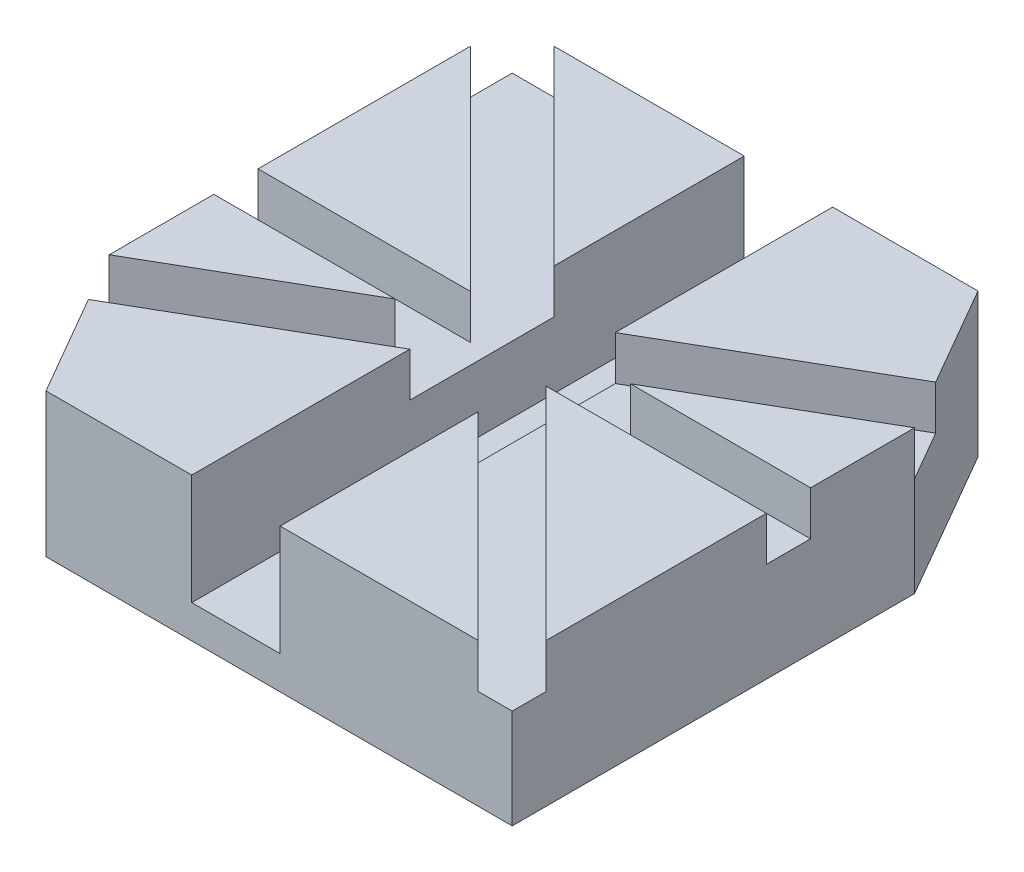
ISO-10303-21;
HEADER;
FILE_DESCRIPTION(('STEP AP214'),'2;1');
FILE_NAME('part.step','',(''),(''),'','','');
FILE_SCHEMA(('AUTOMOTIVE_DESIGN { 1 0 10303 214 1 1 1 1 }'));
ENDSEC;
DATA;
#1=APPLICATION_CONTEXT('core data for automotive mechanical design processes');
#2=APPLICATION_PROTOCOL_DEFINITION('international standard','automotive_design',2000,#1);
#3=PRODUCT_CONTEXT('',#1,'mechanical');
#4=PRODUCT('Part','Part','',(#3));
#5=PRODUCT_RELATED_PRODUCT_CATEGORY('part','',(#4));
#6=PRODUCT_DEFINITION_FORMATION('','',#4);
#7=PRODUCT_DEFINITION_CONTEXT('part definition',#1,'design');
#8=PRODUCT_DEFINITION('design','',#6,#7);
#9=PRODUCT_DEFINITION_SHAPE('','',#8);
#10=(LENGTH_UNIT() NAMED_UNIT(*) SI_UNIT(.MILLI.,.METRE.));
#11=(NAMED_UNIT(*) PLANE_ANGLE_UNIT() SI_UNIT($,.RADIAN.));
#12=(NAMED_UNIT(*) SI_UNIT($,.STERADIAN.) SOLID_ANGLE_UNIT());
#13=UNCERTAINTY_MEASURE_WITH_UNIT(LENGTH_MEASURE(1.E-05),#10,'distance_accuracy_value','');
#14=(GEOMETRIC_REPRESENTATION_CONTEXT(3) GLOBAL_UNCERTAINTY_ASSIGNED_CONTEXT((#13)) GLOBAL_UNIT_ASSIGNED_CONTEXT((#10,
#11,#12)) REPRESENTATION_CONTEXT('',''));
#15=CARTESIAN_POINT('',(0.,0.,0.));
#16=DIRECTION('',(0.,0.,1.));
#17=DIRECTION('',(1.,0.,0.));
#18=AXIS2_PLACEMENT_3D('',#15,#16,#17);
#19=CARTESIAN_POINT('',(0.,13.,0.));
#20=DIRECTION('',(0.,-1.,0.));
#21=DIRECTION('',(0.,0.,-1.));
#22=AXIS2_PLACEMENT_3D('',#19,#20,#21);
#23=PLANE('',#22);
#24=DIRECTION('',(0.,0.,-1.));
#25=VECTOR('',#24,1.);
#26=CARTESIAN_POINT('',(25.,13.,25.));
#27=LINE('',#26,#25);
#28=CARTESIAN_POINT('',(25.,13.,-2.));
#29=VERTEX_POINT('',#28);
#30=CARTESIAN_POINT('',(25.,13.,-11.4104897391883));
#31=VERTEX_POINT('',#30);
#32=EDGE_CURVE('E249',#29,#31,#27,.T.);
#33=ORIENTED_EDGE('',*,*,#32,.T.);
#34=DIRECTION('',(0.866025403784442,0.,-0.499999999999995));
#35=VECTOR('',#34,1.);
#36=CARTESIAN_POINT('',(1.30911300812055,13.,2.26745024291415));
#37=LINE('',#36,#35);
#38=CARTESIAN_POINT('',(8.7005536476201,13.,-2.));
#39=VERTEX_POINT('',#38);
#40=EDGE_CURVE('E461',#39,#31,#37,.T.);
#41=ORIENTED_EDGE('',*,*,#40,.F.);
#42=DIRECTION('',(-1.,0.,0.));
#43=VECTOR('',#42,1.);
#44=CARTESIAN_POINT('',(-25.,13.,-2.));
#45=LINE('',#44,#43);
#46=EDGE_CURVE('E368',#29,#39,#45,.T.);
#47=ORIENTED_EDGE('',*,*,#46,.F.);
#48=EDGE_LOOP('',(#33,#41,#47));
#49=FACE_BOUND('',#48,.T.);
#50=ADVANCED_FACE('F35',(#49),#23,.F.);
#51=DIRECTION('',(1.,0.,0.));
#52=VECTOR('',#51,1.);
#53=CARTESIAN_POINT('',(-25.,13.,2.));
#54=LINE('',#53,#52);
#55=CARTESIAN_POINT('',(5.08162752036712,13.,2.));
#56=VERTEX_POINT('',#55);
#57=CARTESIAN_POINT('',(25.,13.,2.));
#58=VERTEX_POINT('',#57);
#59=EDGE_CURVE('E371',#56,#58,#54,.T.);
#60=ORIENTED_EDGE('',*,*,#59,.F.);
#61=DIRECTION('',(-0.707106781186549,0.,-0.707106781186546));
#62=VECTOR('',#61,1.);
#63=CARTESIAN_POINT('',(1.54081376018355,13.,-1.54081376018356));
#64=LINE('',#63,#62);
#65=CARTESIAN_POINT('',(25.,13.,21.9183724796328));
#66=VERTEX_POINT('',#65);
#67=EDGE_CURVE('E300',#66,#56,#64,.T.);
#68=ORIENTED_EDGE('',*,*,#67,.F.);
#69=EDGE_CURVE('E253',#66,#58,#27,.T.);
#70=ORIENTED_EDGE('',*,*,#69,.T.);
#71=EDGE_LOOP('',(#60,#68,#70));
#72=FACE_BOUND('',#71,.T.);
#73=ADVANCED_FACE('F561',(#72),#23,.F.);
#74=DIRECTION('',(-1.,0.,0.));
#75=VECTOR('',#74,1.);
#76=CARTESIAN_POINT('',(-25.,13.,-25.));
#77=LINE('',#76,#75);
#78=CARTESIAN_POINT('',(-4.,13.,-25.));
#79=VERTEX_POINT('',#78);
#80=CARTESIAN_POINT('',(-21.2371562380707,13.,-25.));
#81=VERTEX_POINT('',#80);
#82=EDGE_CURVE('E411',#79,#81,#77,.T.);
#83=ORIENTED_EDGE('',*,*,#82,.T.);
#84=DIRECTION('',(-0.707106781186552,0.,-0.707106781186543));
#85=VECTOR('',#84,1.);
#86=CARTESIAN_POINT('',(1.88142188096475,13.,-1.88142188096477));
#87=LINE('',#86,#85);
#88=CARTESIAN_POINT('',(-4.,13.,-7.76284376192945));
#89=VERTEX_POINT('',#88);
#90=EDGE_CURVE('E321',#89,#81,#87,.T.);
#91=ORIENTED_EDGE('',*,*,#90,.F.);
#92=DIRECTION('',(0.,0.,1.));
#93=VECTOR('',#92,1.);
#94=CARTESIAN_POINT('',(-4.,13.,-25.));
#95=LINE('',#94,#93);
#96=EDGE_CURVE('E389',#79,#89,#95,.T.);
#97=ORIENTED_EDGE('',*,*,#96,.F.);
#98=EDGE_LOOP('',(#83,#91,#97));
#99=FACE_BOUND('',#98,.T.);
#100=ADVANCED_FACE('F548',(#99),#23,.F.);
#101=DIRECTION('',(0.866025403784437,0.,-0.500000000000003));
#102=VECTOR('',#101,1.);
#103=CARTESIAN_POINT('',(1.2822742025051,13.,2.22096406797368));
#104=LINE('',#103,#102);
#105=CARTESIAN_POINT('',(-22.4354515949898,13.,15.9143994417232));
#106=VERTEX_POINT('',#105);
#107=CARTESIAN_POINT('',(-4.,13.,5.27068650072344));
#108=VERTEX_POINT('',#107);
#109=EDGE_CURVE('E340',#106,#108,#104,.T.);
#110=ORIENTED_EDGE('',*,*,#109,.F.);
#111=DIRECTION('',(-0.499999999999998,0.,-0.86602540378444));
#112=VECTOR('',#111,1.);
#113=CARTESIAN_POINT('',(-25.,13.,11.4724713057758));
#114=LINE('',#113,#112);
#115=CARTESIAN_POINT('',(-17.1898776669193,13.,25.));
#116=VERTEX_POINT('',#115);
#117=EDGE_CURVE('E50',#116,#106,#114,.T.);
#118=ORIENTED_EDGE('',*,*,#117,.F.);
#119=DIRECTION('',(1.,0.,0.));
#120=VECTOR('',#119,1.);
#121=CARTESIAN_POINT('',(-25.,13.,25.));
#122=LINE('',#121,#120);
#123=CARTESIAN_POINT('',(-4.,13.,25.));
#124=VERTEX_POINT('',#123);
#125=EDGE_CURVE('E242',#116,#124,#122,.T.);
#126=ORIENTED_EDGE('',*,*,#125,.T.);
#127=EDGE_CURVE('E400',#108,#124,#95,.T.);
#128=ORIENTED_EDGE('',*,*,#127,.F.);
#129=EDGE_LOOP('',(#110,#118,#126,#128));
#130=FACE_BOUND('',#129,.T.);
#131=ADVANCED_FACE('F473',(#130),#23,.F.);
#132=CARTESIAN_POINT('',(4.,13.,25.));
#133=VERTEX_POINT('',#132);
#134=CARTESIAN_POINT('',(21.918372479633,13.,25.));
#135=VERTEX_POINT('',#134);
#136=EDGE_CURVE('E298',#133,#135,#122,.T.);
#137=ORIENTED_EDGE('',*,*,#136,.T.);
#138=DIRECTION('',(0.707106781186549,0.,0.707106781186546));
#139=VECTOR('',#138,1.);
#140=CARTESIAN_POINT('',(26.826881436994,13.,29.908508957361));
#141=LINE('',#140,#139);
#142=CARTESIAN_POINT('',(4.,13.,7.0816275203671));
#143=VERTEX_POINT('',#142);
#144=EDGE_CURVE('E290',#143,#135,#141,.T.);
#145=ORIENTED_EDGE('',*,*,#144,.F.);
#146=DIRECTION('',(0.,0.,-1.));
#147=VECTOR('',#146,1.);
#148=CARTESIAN_POINT('',(4.,13.,-25.));
#149=LINE('',#148,#147);
#150=EDGE_CURVE('E285',#133,#143,#149,.T.);
#151=ORIENTED_EDGE('',*,*,#150,.F.);
#152=EDGE_LOOP('',(#137,#145,#151));
#153=FACE_BOUND('',#152,.T.);
#154=ADVANCED_FACE('F296',(#153),#23,.F.);
#155=DIRECTION('',(0.,0.,1.));
#156=VECTOR('',#155,1.);
#157=CARTESIAN_POINT('',(-25.,13.,25.));
#158=LINE('',#157,#156);
#159=CARTESIAN_POINT('',(-25.,13.,2.));
#160=VERTEX_POINT('',#159);
#161=CARTESIAN_POINT('',(-25.,13.,11.4724713057758));
#162=VERTEX_POINT('',#161);
#163=EDGE_CURVE('E414',#160,#162,#158,.T.);
#164=ORIENTED_EDGE('',*,*,#163,.T.);
#165=DIRECTION('',(-0.866025403784438,0.,0.500000000000001));
#166=VECTOR('',#165,1.);
#167=CARTESIAN_POINT('',(-28.7644161316793,13.,13.6458579727426));
#168=LINE('',#167,#166);
#169=CARTESIAN_POINT('',(-8.5931984251581,13.,2.));
#170=VERTEX_POINT('',#169);
#171=EDGE_CURVE('E344',#170,#162,#168,.T.);
#172=ORIENTED_EDGE('',*,*,#171,.F.);
#173=EDGE_CURVE('E357',#160,#170,#54,.T.);
#174=ORIENTED_EDGE('',*,*,#173,.F.);
#175=EDGE_LOOP('',(#164,#172,#174));
#176=FACE_BOUND('',#175,.T.);
#177=ADVANCED_FACE('F455',(#176),#23,.F.);
#178=DIRECTION('',(-0.866025403784441,0.,0.499999999999995));
#179=VECTOR('',#178,1.);
#180=CARTESIAN_POINT('',(31.5908585810019,13.,-21.2622576962248));
#181=LINE('',#180,#179);
#182=CARTESIAN_POINT('',(22.3817739837589,13.,-15.9453902250165));
#183=VERTEX_POINT('',#182);
#184=CARTESIAN_POINT('',(4.,13.,-5.33266806731065));
#185=VERTEX_POINT('',#184);
#186=EDGE_CURVE('E493',#183,#185,#181,.T.);
#187=ORIENTED_EDGE('',*,*,#186,.F.);
#188=DIRECTION('',(0.500000000000004,0.,0.866025403784436));
#189=VECTOR('',#188,1.);
#190=CARTESIAN_POINT('',(25.,13.,-11.4104897391883));
#191=LINE('',#190,#189);
#192=CARTESIAN_POINT('',(17.1540925927651,13.,-25.));
#193=VERTEX_POINT('',#192);
#194=EDGE_CURVE('E58',#193,#183,#191,.T.);
#195=ORIENTED_EDGE('',*,*,#194,.F.);
#196=CARTESIAN_POINT('',(4.,13.,-25.));
#197=VERTEX_POINT('',#196);
#198=EDGE_CURVE('E412',#193,#197,#77,.T.);
#199=ORIENTED_EDGE('',*,*,#198,.T.);
#200=EDGE_CURVE('E384',#185,#197,#149,.T.);
#201=ORIENTED_EDGE('',*,*,#200,.F.);
#202=EDGE_LOOP('',(#187,#195,#199,#201));
#203=FACE_BOUND('',#202,.T.);
#204=ADVANCED_FACE('F536',(#203),#23,.F.);
#205=CARTESIAN_POINT('',(25.,13.,25.));
#206=DIRECTION('',(-1.,0.,0.));
#207=DIRECTION('',(0.,0.,1.));
#208=AXIS2_PLACEMENT_3D('',#205,#206,#207);
#209=PLANE('',#208);
#210=DIRECTION('',(0.,0.,-1.));
#211=VECTOR('',#210,1.);
#212=CARTESIAN_POINT('',(25.,0.,25.));
#213=LINE('',#212,#211);
#214=CARTESIAN_POINT('',(25.,0.,25.));
#215=VERTEX_POINT('',#214);
#216=CARTESIAN_POINT('',(25.,0.,-11.4104897391883));
#217=VERTEX_POINT('',#216);
#218=EDGE_CURVE('E248',#215,#217,#213,.T.);
#219=ORIENTED_EDGE('',*,*,#218,.T.);
#220=DIRECTION('',(0.,1.,0.));
#221=VECTOR('',#220,1.);
#222=CARTESIAN_POINT('',(25.,0.,-11.4104897391883));
#223=LINE('',#222,#221);
#224=CARTESIAN_POINT('',(25.,9.,-11.4104897391883));
#225=VERTEX_POINT('',#224);
#226=EDGE_CURVE('E474',#217,#225,#223,.T.);
#227=ORIENTED_EDGE('',*,*,#226,.T.);
#228=DIRECTION('',(0.,1.,0.));
#229=VECTOR('',#228,1.);
#230=CARTESIAN_POINT('',(25.,13.,-11.4104897391883));
#231=LINE('',#230,#229);
#232=EDGE_CURVE('E303',#225,#31,#231,.T.);
#233=ORIENTED_EDGE('',*,*,#232,.T.);
#234=ORIENTED_EDGE('',*,*,#32,.F.);
#235=DIRECTION('',(0.,1.,0.));
#236=VECTOR('',#235,1.);
#237=CARTESIAN_POINT('',(25.,9.,-2.));
#238=LINE('',#237,#236);
#239=CARTESIAN_POINT('',(25.,9.,-2.));
#240=VERTEX_POINT('',#239);
#241=EDGE_CURVE('E367',#240,#29,#238,.T.);
#242=ORIENTED_EDGE('',*,*,#241,.F.);
#243=DIRECTION('',(0.,0.,-1.));
#244=VECTOR('',#243,1.);
#245=CARTESIAN_POINT('',(25.,9.,-2.));
#246=LINE('',#245,#244);
#247=CARTESIAN_POINT('',(25.,9.,2.));
#248=VERTEX_POINT('',#247);
#249=EDGE_CURVE('E353',#248,#240,#246,.T.);
#250=ORIENTED_EDGE('',*,*,#249,.F.);
#251=DIRECTION('',(0.,1.,0.));
#252=VECTOR('',#251,1.);
#253=CARTESIAN_POINT('',(25.,9.,2.));
#254=LINE('',#253,#252);
#255=EDGE_CURVE('E374',#248,#58,#254,.T.);
#256=ORIENTED_EDGE('',*,*,#255,.T.);
#257=ORIENTED_EDGE('',*,*,#69,.F.);
#258=DIRECTION('',(0.,-1.,0.));
#259=VECTOR('',#258,1.);
#260=CARTESIAN_POINT('',(25.,13.,21.9183724796328));
#261=LINE('',#260,#259);
#262=CARTESIAN_POINT('',(25.,9.,21.9183724796328));
#263=VERTEX_POINT('',#262);
#264=EDGE_CURVE('E310',#66,#263,#261,.T.);
#265=ORIENTED_EDGE('',*,*,#264,.T.);
#266=DIRECTION('',(0.,0.,1.));
#267=VECTOR('',#266,1.);
#268=CARTESIAN_POINT('',(25.,9.,25.));
#269=LINE('',#268,#267);
#270=CARTESIAN_POINT('',(25.,9.,25.));
#271=VERTEX_POINT('',#270);
#272=EDGE_CURVE('E316',#263,#271,#269,.T.);
#273=ORIENTED_EDGE('',*,*,#272,.T.);
#274=DIRECTION('',(0.,-1.,0.));
#275=VECTOR('',#274,1.);
#276=CARTESIAN_POINT('',(25.,13.,25.));
#277=LINE('',#276,#275);
#278=EDGE_CURVE('E259',#271,#215,#277,.T.);
#279=ORIENTED_EDGE('',*,*,#278,.T.);
#280=EDGE_LOOP('',(#219,#227,#233,#234,#242,#250,#256,#257,#265,#273,#279));
#281=FACE_BOUND('',#280,.T.);
#282=ADVANCED_FACE('F37',(#281),#209,.F.);
#283=CARTESIAN_POINT('',(-25.,13.,-25.));
#284=DIRECTION('',(0.,0.,1.));
#285=DIRECTION('',(1.,0.,0.));
#286=AXIS2_PLACEMENT_3D('',#283,#284,#285);
#287=PLANE('',#286);
#288=ORIENTED_EDGE('',*,*,#198,.F.);
#289=DIRECTION('',(0.,1.,0.));
#290=VECTOR('',#289,1.);
#291=CARTESIAN_POINT('',(17.1540925927651,0.,-25.));
#292=LINE('',#291,#290);
#293=CARTESIAN_POINT('',(17.1540925927651,0.,-25.));
#294=VERTEX_POINT('',#293);
#295=EDGE_CURVE('E425',#294,#193,#292,.T.);
#296=ORIENTED_EDGE('',*,*,#295,.F.);
#297=DIRECTION('',(-1.,0.,0.));
#298=VECTOR('',#297,1.);
#299=CARTESIAN_POINT('',(-25.,0.,-25.));
#300=LINE('',#299,#298);
#301=CARTESIAN_POINT('',(-25.,0.,-25.));
#302=VERTEX_POINT('',#301);
#303=EDGE_CURVE('E255',#294,#302,#300,.T.);
#304=ORIENTED_EDGE('',*,*,#303,.T.);
#305=DIRECTION('',(0.,-1.,0.));
#306=VECTOR('',#305,1.);
#307=CARTESIAN_POINT('',(-25.,13.,-25.));
#308=LINE('',#307,#306);
#309=CARTESIAN_POINT('',(-25.,9.,-25.));
#310=VERTEX_POINT('',#309);
#311=EDGE_CURVE('E261',#310,#302,#308,.T.);
#312=ORIENTED_EDGE('',*,*,#311,.F.);
#313=DIRECTION('',(-1.,0.,0.));
#314=VECTOR('',#313,1.);
#315=CARTESIAN_POINT('',(-25.,9.,-25.));
#316=LINE('',#315,#314);
#317=CARTESIAN_POINT('',(-21.2371562380707,9.,-25.));
#318=VERTEX_POINT('',#317);
#319=EDGE_CURVE('E332',#318,#310,#316,.T.);
#320=ORIENTED_EDGE('',*,*,#319,.F.);
#321=DIRECTION('',(0.,1.,0.));
#322=VECTOR('',#321,1.);
#323=CARTESIAN_POINT('',(-21.2371562380708,13.,-25.));
#324=LINE('',#323,#322);
#325=EDGE_CURVE('E337',#318,#81,#324,.T.);
#326=ORIENTED_EDGE('',*,*,#325,.T.);
#327=ORIENTED_EDGE('',*,*,#82,.F.);
#328=DIRECTION('',(0.,1.,0.));
#329=VECTOR('',#328,1.);
#330=CARTESIAN_POINT('',(-4.,3.,-25.));
#331=LINE('',#330,#329);
#332=CARTESIAN_POINT('',(-4.,3.,-25.));
#333=VERTEX_POINT('',#332);
#334=EDGE_CURVE('E407',#333,#79,#331,.T.);
#335=ORIENTED_EDGE('',*,*,#334,.F.);
#336=DIRECTION('',(-1.,0.,0.));
#337=VECTOR('',#336,1.);
#338=CARTESIAN_POINT('',(-4.,3.,-25.));
#339=LINE('',#338,#337);
#340=CARTESIAN_POINT('',(4.,3.,-25.));
#341=VERTEX_POINT('',#340);
#342=EDGE_CURVE('E388',#341,#333,#339,.T.);
#343=ORIENTED_EDGE('',*,*,#342,.F.);
#344=DIRECTION('',(0.,1.,0.));
#345=VECTOR('',#344,1.);
#346=CARTESIAN_POINT('',(4.,3.,-25.));
#347=LINE('',#346,#345);
#348=EDGE_CURVE('E398',#341,#197,#347,.T.);
#349=ORIENTED_EDGE('',*,*,#348,.T.);
#350=EDGE_LOOP('',(#288,#296,#304,#312,#320,#326,#327,#335,#343,#349));
#351=FACE_BOUND('',#350,.T.);
#352=ADVANCED_FACE('F423',(#351),#287,.F.);
#353=CARTESIAN_POINT('',(-25.,13.,25.));
#354=DIRECTION('',(1.,0.,0.));
#355=DIRECTION('',(0.,0.,-1.));
#356=AXIS2_PLACEMENT_3D('',#353,#354,#355);
#357=PLANE('',#356);
#358=DIRECTION('',(0.,0.,1.));
#359=VECTOR('',#358,1.);
#360=CARTESIAN_POINT('',(-25.,0.,25.));
#361=LINE('',#360,#359);
#362=CARTESIAN_POINT('',(-25.,0.,11.4724713057758));
#363=VERTEX_POINT('',#362);
#364=EDGE_CURVE('E250',#302,#363,#361,.T.);
#365=ORIENTED_EDGE('',*,*,#364,.T.);
#366=DIRECTION('',(0.,1.,0.));
#367=VECTOR('',#366,1.);
#368=CARTESIAN_POINT('',(-25.,0.,11.4724713057758));
#369=LINE('',#368,#367);
#370=CARTESIAN_POINT('',(-25.,9.,11.4724713057758));
#371=VERTEX_POINT('',#370);
#372=EDGE_CURVE('E229',#363,#371,#369,.T.);
#373=ORIENTED_EDGE('',*,*,#372,.T.);
#374=DIRECTION('',(0.,1.,0.));
#375=VECTOR('',#374,1.);
#376=CARTESIAN_POINT('',(-25.,13.,11.4724713057758));
#377=LINE('',#376,#375);
#378=EDGE_CURVE('E347',#371,#162,#377,.T.);
#379=ORIENTED_EDGE('',*,*,#378,.T.);
#380=ORIENTED_EDGE('',*,*,#163,.F.);
#381=DIRECTION('',(0.,1.,0.));
#382=VECTOR('',#381,1.);
#383=CARTESIAN_POINT('',(-25.,9.,2.));
#384=LINE('',#383,#382);
#385=CARTESIAN_POINT('',(-25.,9.,2.));
#386=VERTEX_POINT('',#385);
#387=EDGE_CURVE('E377',#386,#160,#384,.T.);
#388=ORIENTED_EDGE('',*,*,#387,.F.);
#389=DIRECTION('',(0.,0.,1.));
#390=VECTOR('',#389,1.);
#391=CARTESIAN_POINT('',(-25.,9.,-2.));
#392=LINE('',#391,#390);
#393=CARTESIAN_POINT('',(-25.,9.,-2.));
#394=VERTEX_POINT('',#393);
#395=EDGE_CURVE('E361',#394,#386,#392,.T.);
#396=ORIENTED_EDGE('',*,*,#395,.F.);
#397=DIRECTION('',(0.,1.,0.));
#398=VECTOR('',#397,1.);
#399=CARTESIAN_POINT('',(-25.,9.,-2.));
#400=LINE('',#399,#398);
#401=CARTESIAN_POINT('',(-25.,13.,-2.));
#402=VERTEX_POINT('',#401);
#403=EDGE_CURVE('E379',#394,#402,#400,.T.);
#404=ORIENTED_EDGE('',*,*,#403,.T.);
#405=CARTESIAN_POINT('',(-25.,13.,-21.2371562380702));
#406=VERTEX_POINT('',#405);
#407=EDGE_CURVE('E415',#406,#402,#158,.T.);
#408=ORIENTED_EDGE('',*,*,#407,.F.);
#409=DIRECTION('',(0.,-1.,0.));
#410=VECTOR('',#409,1.);
#411=CARTESIAN_POINT('',(-25.,13.,-21.2371562380702));
#412=LINE('',#411,#410);
#413=CARTESIAN_POINT('',(-25.,9.,-21.2371562380702));
#414=VERTEX_POINT('',#413);
#415=EDGE_CURVE('E334',#406,#414,#412,.T.);
#416=ORIENTED_EDGE('',*,*,#415,.T.);
#417=DIRECTION('',(0.,0.,1.));
#418=VECTOR('',#417,1.);
#419=CARTESIAN_POINT('',(-25.,9.,25.));
#420=LINE('',#419,#418);
#421=EDGE_CURVE('E328',#310,#414,#420,.T.);
#422=ORIENTED_EDGE('',*,*,#421,.F.);
#423=ORIENTED_EDGE('',*,*,#311,.T.);
#424=EDGE_LOOP('',(#365,#373,#379,#380,#388,#396,#404,#408,#416,#422,#423));
#425=FACE_BOUND('',#424,.T.);
#426=ADVANCED_FACE('F428',(#425),#357,.F.);
#427=CARTESIAN_POINT('',(-25.,13.,25.));
#428=DIRECTION('',(0.,0.,-1.));
#429=DIRECTION('',(-1.,0.,0.));
#430=AXIS2_PLACEMENT_3D('',#427,#428,#429);
#431=PLANE('',#430);
#432=ORIENTED_EDGE('',*,*,#125,.F.);
#433=DIRECTION('',(0.,1.,0.));
#434=VECTOR('',#433,1.);
#435=CARTESIAN_POINT('',(-17.1898776669193,0.,25.));
#436=LINE('',#435,#434);
#437=CARTESIAN_POINT('',(-17.1898776669193,0.,25.));
#438=VERTEX_POINT('',#437);
#439=EDGE_CURVE('E227',#438,#116,#436,.T.);
#440=ORIENTED_EDGE('',*,*,#439,.F.);
#441=DIRECTION('',(1.,0.,0.));
#442=VECTOR('',#441,1.);
#443=CARTESIAN_POINT('',(-25.,0.,25.));
#444=LINE('',#443,#442);
#445=EDGE_CURVE('E239',#438,#215,#444,.T.);
#446=ORIENTED_EDGE('',*,*,#445,.T.);
#447=ORIENTED_EDGE('',*,*,#278,.F.);
#448=DIRECTION('',(-1.,0.,0.));
#449=VECTOR('',#448,1.);
#450=CARTESIAN_POINT('',(-25.,9.,25.));
#451=LINE('',#450,#449);
#452=CARTESIAN_POINT('',(21.918372479633,9.,25.));
#453=VERTEX_POINT('',#452);
#454=EDGE_CURVE('E313',#271,#453,#451,.T.);
#455=ORIENTED_EDGE('',*,*,#454,.T.);
#456=DIRECTION('',(0.,1.,0.));
#457=VECTOR('',#456,1.);
#458=CARTESIAN_POINT('',(21.918372479633,13.,25.));
#459=LINE('',#458,#457);
#460=EDGE_CURVE('E319',#453,#135,#459,.T.);
#461=ORIENTED_EDGE('',*,*,#460,.T.);
#462=ORIENTED_EDGE('',*,*,#136,.F.);
#463=DIRECTION('',(0.,1.,0.));
#464=VECTOR('',#463,1.);
#465=CARTESIAN_POINT('',(4.,3.,25.));
#466=LINE('',#465,#464);
#467=CARTESIAN_POINT('',(4.,3.,25.));
#468=VERTEX_POINT('',#467);
#469=EDGE_CURVE('E403',#468,#133,#466,.T.);
#470=ORIENTED_EDGE('',*,*,#469,.F.);
#471=DIRECTION('',(1.,0.,0.));
#472=VECTOR('',#471,1.);
#473=CARTESIAN_POINT('',(-4.,3.,25.));
#474=LINE('',#473,#472);
#475=CARTESIAN_POINT('',(-4.,3.,25.));
#476=VERTEX_POINT('',#475);
#477=EDGE_CURVE('E395',#476,#468,#474,.T.);
#478=ORIENTED_EDGE('',*,*,#477,.F.);
#479=DIRECTION('',(0.,1.,0.));
#480=VECTOR('',#479,1.);
#481=CARTESIAN_POINT('',(-4.,3.,25.));
#482=LINE('',#481,#480);
#483=EDGE_CURVE('E405',#476,#124,#482,.T.);
#484=ORIENTED_EDGE('',*,*,#483,.T.);
#485=EDGE_LOOP('',(#432,#440,#446,#447,#455,#461,#462,#470,#478,#484));
#486=FACE_BOUND('',#485,.T.);
#487=ADVANCED_FACE('F237',(#486),#431,.F.);
#488=CARTESIAN_POINT('',(-5.76284376192956,13.,-2.));
#489=VERTEX_POINT('',#488);
#490=EDGE_CURVE('E352',#489,#402,#45,.T.);
#491=ORIENTED_EDGE('',*,*,#490,.F.);
#492=DIRECTION('',(0.707106781186551,0.,0.707106781186544));
#493=VECTOR('',#492,1.);
#494=CARTESIAN_POINT('',(-28.4874320035801,13.,-24.7245882416502));
#495=LINE('',#494,#493);
#496=EDGE_CURVE('E326',#406,#489,#495,.T.);
#497=ORIENTED_EDGE('',*,*,#496,.F.);
#498=ORIENTED_EDGE('',*,*,#407,.T.);
#499=EDGE_LOOP('',(#491,#497,#498));
#500=FACE_BOUND('',#499,.T.);
#501=ADVANCED_FACE('F563',(#500),#23,.F.);
#502=CARTESIAN_POINT('',(0.,0.,0.));
#503=DIRECTION('',(0.,-1.,0.));
#504=DIRECTION('',(0.,0.,-1.));
#505=AXIS2_PLACEMENT_3D('',#502,#503,#504);
#506=PLANE('',#505);
#507=DIRECTION('',(-0.499999999999998,0.,-0.86602540378444));
#508=VECTOR('',#507,1.);
#509=CARTESIAN_POINT('',(-25.,0.,11.4724713057758));
#510=LINE('',#509,#508);
#511=EDGE_CURVE('E224',#438,#363,#510,.T.);
#512=ORIENTED_EDGE('',*,*,#511,.T.);
#513=ORIENTED_EDGE('',*,*,#364,.F.);
#514=ORIENTED_EDGE('',*,*,#303,.F.);
#515=DIRECTION('',(0.500000000000004,0.,0.866025403784436));
#516=VECTOR('',#515,1.);
#517=CARTESIAN_POINT('',(25.,0.,-11.4104897391883));
#518=LINE('',#517,#516);
#519=EDGE_CURVE('E481',#294,#217,#518,.T.);
#520=ORIENTED_EDGE('',*,*,#519,.T.);
#521=ORIENTED_EDGE('',*,*,#218,.F.);
#522=ORIENTED_EDGE('',*,*,#445,.F.);
#523=EDGE_LOOP('',(#512,#513,#514,#520,#521,#522));
#524=FACE_BOUND('',#523,.T.);
#525=ADVANCED_FACE('F245',(#524),#506,.T.);
#526=CARTESIAN_POINT('',(4.,3.,-25.));
#527=DIRECTION('',(1.,0.,0.));
#528=DIRECTION('',(0.,0.,-1.));
#529=AXIS2_PLACEMENT_3D('',#526,#527,#528);
#530=PLANE('',#529);
#531=DIRECTION('',(0.,0.,1.));
#532=VECTOR('',#531,1.);
#533=CARTESIAN_POINT('',(4.,9.,-25.));
#534=LINE('',#533,#532);
#535=CARTESIAN_POINT('',(4.,9.,-5.33266806731065));
#536=VERTEX_POINT('',#535);
#537=CARTESIAN_POINT('',(4.,9.,7.0816275203671));
#538=VERTEX_POINT('',#537);
#539=EDGE_CURVE('E282',#536,#538,#534,.T.);
#540=ORIENTED_EDGE('',*,*,#539,.F.);
#541=DIRECTION('',(0.,1.,0.));
#542=VECTOR('',#541,1.);
#543=CARTESIAN_POINT('',(4.,3.,-5.33266806731065));
#544=LINE('',#543,#542);
#545=EDGE_CURVE('E11',#536,#185,#544,.T.);
#546=ORIENTED_EDGE('',*,*,#545,.T.);
#547=ORIENTED_EDGE('',*,*,#200,.T.);
#548=ORIENTED_EDGE('',*,*,#348,.F.);
#549=DIRECTION('',(0.,0.,-1.));
#550=VECTOR('',#549,1.);
#551=CARTESIAN_POINT('',(4.,3.,-25.));
#552=LINE('',#551,#550);
#553=EDGE_CURVE('E385',#468,#341,#552,.T.);
#554=ORIENTED_EDGE('',*,*,#553,.F.);
#555=ORIENTED_EDGE('',*,*,#469,.T.);
#556=ORIENTED_EDGE('',*,*,#150,.T.);
#557=DIRECTION('',(0.,-1.,0.));
#558=VECTOR('',#557,1.);
#559=CARTESIAN_POINT('',(4.,3.,7.08162752036708));
#560=LINE('',#559,#558);
#561=EDGE_CURVE('E43',#143,#538,#560,.T.);
#562=ORIENTED_EDGE('',*,*,#561,.T.);
#563=EDGE_LOOP('',(#540,#546,#547,#548,#554,#555,#556,#562));
#564=FACE_BOUND('',#563,.T.);
#565=ADVANCED_FACE('F281',(#564),#530,.F.);
#566=CARTESIAN_POINT('',(-4.,3.,-25.));
#567=DIRECTION('',(-1.,0.,0.));
#568=DIRECTION('',(0.,0.,1.));
#569=AXIS2_PLACEMENT_3D('',#566,#567,#568);
#570=PLANE('',#569);
#571=ORIENTED_EDGE('',*,*,#96,.T.);
#572=DIRECTION('',(0.,-1.,0.));
#573=VECTOR('',#572,1.);
#574=CARTESIAN_POINT('',(-4.,3.,-7.76284376192945));
#575=LINE('',#574,#573);
#576=CARTESIAN_POINT('',(-4.,9.,-7.76284376192945));
#577=VERTEX_POINT('',#576);
#578=EDGE_CURVE('E275',#89,#577,#575,.T.);
#579=ORIENTED_EDGE('',*,*,#578,.T.);
#580=DIRECTION('',(0.,0.,-1.));
#581=VECTOR('',#580,1.);
#582=CARTESIAN_POINT('',(-4.,9.,-25.));
#583=LINE('',#582,#581);
#584=CARTESIAN_POINT('',(-4.,9.,5.27068650072344));
#585=VERTEX_POINT('',#584);
#586=EDGE_CURVE('E264',#585,#577,#583,.T.);
#587=ORIENTED_EDGE('',*,*,#586,.F.);
#588=DIRECTION('',(0.,1.,0.));
#589=VECTOR('',#588,1.);
#590=CARTESIAN_POINT('',(-4.,3.,5.27068650072343));
#591=LINE('',#590,#589);
#592=EDGE_CURVE('E269',#585,#108,#591,.T.);
#593=ORIENTED_EDGE('',*,*,#592,.T.);
#594=ORIENTED_EDGE('',*,*,#127,.T.);
#595=ORIENTED_EDGE('',*,*,#483,.F.);
#596=DIRECTION('',(0.,0.,1.));
#597=VECTOR('',#596,1.);
#598=CARTESIAN_POINT('',(-4.,3.,-25.));
#599=LINE('',#598,#597);
#600=EDGE_CURVE('E392',#333,#476,#599,.T.);
#601=ORIENTED_EDGE('',*,*,#600,.F.);
#602=ORIENTED_EDGE('',*,*,#334,.T.);
#603=EDGE_LOOP('',(#571,#579,#587,#593,#594,#595,#601,#602));
#604=FACE_BOUND('',#603,.T.);
#605=ADVANCED_FACE('F471',(#604),#570,.F.);
#606=CARTESIAN_POINT('',(0.,3.,0.));
#607=DIRECTION('',(0.,1.,0.));
#608=DIRECTION('',(0.,0.,1.));
#609=AXIS2_PLACEMENT_3D('',#606,#607,#608);
#610=PLANE('',#609);
#611=ORIENTED_EDGE('',*,*,#553,.T.);
#612=ORIENTED_EDGE('',*,*,#342,.T.);
#613=ORIENTED_EDGE('',*,*,#600,.T.);
#614=ORIENTED_EDGE('',*,*,#477,.T.);
#615=EDGE_LOOP('',(#611,#612,#613,#614));
#616=FACE_BOUND('',#615,.T.);
#617=ADVANCED_FACE('F540',(#616),#610,.T.);
#618=CARTESIAN_POINT('',(0.,9.,0.));
#619=DIRECTION('',(0.,1.,0.));
#620=DIRECTION('',(0.,0.,1.));
#621=AXIS2_PLACEMENT_3D('',#618,#619,#620);
#622=PLANE('',#621);
#623=DIRECTION('',(-0.499999999999998,0.,-0.86602540378444));
#624=VECTOR('',#623,1.);
#625=CARTESIAN_POINT('',(-23.717725797495,9.,13.6934353737494));
#626=LINE('',#625,#624);
#627=CARTESIAN_POINT('',(-22.4354515949898,9.,15.9143994417232));
#628=VERTEX_POINT('',#627);
#629=EDGE_CURVE('E458',#628,#371,#626,.T.);
#630=ORIENTED_EDGE('',*,*,#629,.F.);
#631=DIRECTION('',(0.866025403784437,0.,-0.500000000000003));
#632=VECTOR('',#631,1.);
#633=CARTESIAN_POINT('',(1.2822742025051,9.,2.22096406797368));
#634=LINE('',#633,#632);
#635=EDGE_CURVE('E341',#628,#585,#634,.T.);
#636=ORIENTED_EDGE('',*,*,#635,.T.);
#637=ORIENTED_EDGE('',*,*,#586,.T.);
#638=DIRECTION('',(-0.707106781186552,0.,-0.707106781186543));
#639=VECTOR('',#638,1.);
#640=CARTESIAN_POINT('',(1.88142188096475,9.,-1.88142188096477));
#641=LINE('',#640,#639);
#642=EDGE_CURVE('E322',#577,#318,#641,.T.);
#643=ORIENTED_EDGE('',*,*,#642,.T.);
#644=ORIENTED_EDGE('',*,*,#319,.T.);
#645=ORIENTED_EDGE('',*,*,#421,.T.);
#646=DIRECTION('',(0.707106781186551,0.,0.707106781186544));
#647=VECTOR('',#646,1.);
#648=CARTESIAN_POINT('',(-28.4874320035801,9.,-24.7245882416502));
#649=LINE('',#648,#647);
#650=CARTESIAN_POINT('',(-5.76284376192956,9.,-2.));
#651=VERTEX_POINT('',#650);
#652=EDGE_CURVE('E325',#414,#651,#649,.T.);
#653=ORIENTED_EDGE('',*,*,#652,.T.);
#654=DIRECTION('',(-1.,0.,0.));
#655=VECTOR('',#654,1.);
#656=CARTESIAN_POINT('',(-25.,9.,-2.));
#657=LINE('',#656,#655);
#658=EDGE_CURVE('E356',#651,#394,#657,.T.);
#659=ORIENTED_EDGE('',*,*,#658,.T.);
#660=ORIENTED_EDGE('',*,*,#395,.T.);
#661=DIRECTION('',(1.,0.,0.));
#662=VECTOR('',#661,1.);
#663=CARTESIAN_POINT('',(-25.,9.,2.));
#664=LINE('',#663,#662);
#665=CARTESIAN_POINT('',(-8.5931984251581,9.,2.));
#666=VERTEX_POINT('',#665);
#667=EDGE_CURVE('E364',#386,#666,#664,.T.);
#668=ORIENTED_EDGE('',*,*,#667,.T.);
#669=DIRECTION('',(-0.866025403784438,0.,0.500000000000001));
#670=VECTOR('',#669,1.);
#671=CARTESIAN_POINT('',(-28.7644161316793,9.,13.6458579727426));
#672=LINE('',#671,#670);
#673=EDGE_CURVE('E343',#666,#371,#672,.T.);
#674=ORIENTED_EDGE('',*,*,#673,.T.);
#675=EDGE_LOOP('',(#630,#636,#637,#643,#644,#645,#653,#659,#660,#668,#674));
#676=FACE_BOUND('',#675,.T.);
#677=ADVANCED_FACE('F433',(#676),#622,.T.);
#678=CARTESIAN_POINT('',(-25.,9.,-2.));
#679=DIRECTION('',(0.,0.,-1.));
#680=DIRECTION('',(-1.,0.,0.));
#681=AXIS2_PLACEMENT_3D('',#678,#679,#680);
#682=PLANE('',#681);
#683=ORIENTED_EDGE('',*,*,#658,.F.);
#684=DIRECTION('',(0.,1.,0.));
#685=VECTOR('',#684,1.);
#686=CARTESIAN_POINT('',(-5.76284376192956,9.,-2.));
#687=LINE('',#686,#685);
#688=EDGE_CURVE('E272',#651,#489,#687,.T.);
#689=ORIENTED_EDGE('',*,*,#688,.T.);
#690=ORIENTED_EDGE('',*,*,#490,.T.);
#691=ORIENTED_EDGE('',*,*,#403,.F.);
#692=EDGE_LOOP('',(#683,#689,#690,#691));
#693=FACE_BOUND('',#692,.T.);
#694=ADVANCED_FACE('F443',(#693),#682,.F.);
#695=CARTESIAN_POINT('',(-25.,9.,2.));
#696=DIRECTION('',(0.,0.,1.));
#697=DIRECTION('',(1.,0.,0.));
#698=AXIS2_PLACEMENT_3D('',#695,#696,#697);
#699=PLANE('',#698);
#700=ORIENTED_EDGE('',*,*,#173,.T.);
#701=DIRECTION('',(0.,-1.,0.));
#702=VECTOR('',#701,1.);
#703=CARTESIAN_POINT('',(-8.5931984251581,9.,2.));
#704=LINE('',#703,#702);
#705=EDGE_CURVE('E266',#170,#666,#704,.T.);
#706=ORIENTED_EDGE('',*,*,#705,.T.);
#707=ORIENTED_EDGE('',*,*,#667,.F.);
#708=ORIENTED_EDGE('',*,*,#387,.T.);
#709=EDGE_LOOP('',(#700,#706,#707,#708));
#710=FACE_BOUND('',#709,.T.);
#711=ADVANCED_FACE('F448',(#710),#699,.F.);
#712=CARTESIAN_POINT('',(5.08162752036711,9.,2.));
#713=VERTEX_POINT('',#712);
#714=EDGE_CURVE('E363',#713,#248,#664,.T.);
#715=ORIENTED_EDGE('',*,*,#714,.F.);
#716=DIRECTION('',(0.,1.,0.));
#717=VECTOR('',#716,1.);
#718=CARTESIAN_POINT('',(5.08162752036712,9.,2.));
#719=LINE('',#718,#717);
#720=EDGE_CURVE('E307',#713,#56,#719,.T.);
#721=ORIENTED_EDGE('',*,*,#720,.T.);
#722=ORIENTED_EDGE('',*,*,#59,.T.);
#723=ORIENTED_EDGE('',*,*,#255,.F.);
#724=EDGE_LOOP('',(#715,#721,#722,#723));
#725=FACE_BOUND('',#724,.T.);
#726=ADVANCED_FACE('F516',(#725),#699,.F.);
#727=ORIENTED_EDGE('',*,*,#46,.T.);
#728=DIRECTION('',(0.,-1.,0.));
#729=VECTOR('',#728,1.);
#730=CARTESIAN_POINT('',(8.7005536476201,9.,-2.));
#731=LINE('',#730,#729);
#732=CARTESIAN_POINT('',(8.7005536476201,9.,-2.));
#733=VERTEX_POINT('',#732);
#734=EDGE_CURVE('E495',#39,#733,#731,.T.);
#735=ORIENTED_EDGE('',*,*,#734,.T.);
#736=EDGE_CURVE('E358',#240,#733,#657,.T.);
#737=ORIENTED_EDGE('',*,*,#736,.F.);
#738=ORIENTED_EDGE('',*,*,#241,.T.);
#739=EDGE_LOOP('',(#727,#735,#737,#738));
#740=FACE_BOUND('',#739,.T.);
#741=ADVANCED_FACE('F522',(#740),#682,.F.);
#742=DIRECTION('',(0.500000000000004,0.,0.866025403784436));
#743=VECTOR('',#742,1.);
#744=CARTESIAN_POINT('',(23.6908869918793,9.,-13.6779399821027));
#745=LINE('',#744,#743);
#746=CARTESIAN_POINT('',(22.3817739837589,9.,-15.9453902250166));
#747=VERTEX_POINT('',#746);
#748=EDGE_CURVE('E486',#747,#225,#745,.T.);
#749=ORIENTED_EDGE('',*,*,#748,.F.);
#750=DIRECTION('',(-0.866025403784441,0.,0.499999999999995));
#751=VECTOR('',#750,1.);
#752=CARTESIAN_POINT('',(31.5908585810019,9.,-21.2622576962248));
#753=LINE('',#752,#751);
#754=EDGE_CURVE('E492',#747,#536,#753,.T.);
#755=ORIENTED_EDGE('',*,*,#754,.T.);
#756=ORIENTED_EDGE('',*,*,#539,.T.);
#757=DIRECTION('',(0.707106781186549,0.,0.707106781186546));
#758=VECTOR('',#757,1.);
#759=CARTESIAN_POINT('',(26.826881436994,9.,29.908508957361));
#760=LINE('',#759,#758);
#761=EDGE_CURVE('E293',#538,#453,#760,.T.);
#762=ORIENTED_EDGE('',*,*,#761,.T.);
#763=ORIENTED_EDGE('',*,*,#454,.F.);
#764=ORIENTED_EDGE('',*,*,#272,.F.);
#765=DIRECTION('',(-0.707106781186549,0.,-0.707106781186546));
#766=VECTOR('',#765,1.);
#767=CARTESIAN_POINT('',(1.54081376018355,9.,-1.54081376018356));
#768=LINE('',#767,#766);
#769=EDGE_CURVE('E299',#263,#713,#768,.T.);
#770=ORIENTED_EDGE('',*,*,#769,.T.);
#771=ORIENTED_EDGE('',*,*,#714,.T.);
#772=ORIENTED_EDGE('',*,*,#249,.T.);
#773=ORIENTED_EDGE('',*,*,#736,.T.);
#774=DIRECTION('',(0.866025403784442,0.,-0.499999999999995));
#775=VECTOR('',#774,1.);
#776=CARTESIAN_POINT('',(1.30911300812055,9.,2.26745024291415));
#777=LINE('',#776,#775);
#778=EDGE_CURVE('E489',#733,#225,#777,.T.);
#779=ORIENTED_EDGE('',*,*,#778,.T.);
#780=EDGE_LOOP('',(#749,#755,#756,#762,#763,#764,#770,#771,#772,#773,#779));
#781=FACE_BOUND('',#780,.T.);
#782=ADVANCED_FACE('F503',(#781),#622,.T.);
#783=CARTESIAN_POINT('',(1.2822742025051,9.,2.22096406797368));
#784=DIRECTION('',(0.500000000000003,0.,0.866025403784437));
#785=DIRECTION('',(0.866025403784437,0.,-0.500000000000003));
#786=AXIS2_PLACEMENT_3D('',#783,#784,#785);
#787=PLANE('',#786);
#788=ORIENTED_EDGE('',*,*,#635,.F.);
#789=DIRECTION('',(0.,1.,0.));
#790=VECTOR('',#789,1.);
#791=CARTESIAN_POINT('',(-22.4354515949898,9.,15.9143994417232));
#792=LINE('',#791,#790);
#793=EDGE_CURVE('E462',#628,#106,#792,.T.);
#794=ORIENTED_EDGE('',*,*,#793,.T.);
#795=ORIENTED_EDGE('',*,*,#109,.T.);
#796=ORIENTED_EDGE('',*,*,#592,.F.);
#797=EDGE_LOOP('',(#788,#794,#795,#796));
#798=FACE_BOUND('',#797,.T.);
#799=ADVANCED_FACE('F466',(#798),#787,.F.);
#800=CARTESIAN_POINT('',(-28.7644161316793,9.,13.6458579727426));
#801=DIRECTION('',(-0.500000000000001,0.,-0.866025403784438));
#802=DIRECTION('',(-0.866025403784438,0.,0.500000000000001));
#803=AXIS2_PLACEMENT_3D('',#800,#801,#802);
#804=PLANE('',#803);
#805=ORIENTED_EDGE('',*,*,#673,.F.);
#806=ORIENTED_EDGE('',*,*,#705,.F.);
#807=ORIENTED_EDGE('',*,*,#171,.T.);
#808=ORIENTED_EDGE('',*,*,#378,.F.);
#809=EDGE_LOOP('',(#805,#806,#807,#808));
#810=FACE_BOUND('',#809,.T.);
#811=ADVANCED_FACE('F457',(#810),#804,.F.);
#812=CARTESIAN_POINT('',(1.88142188096475,9.,-1.88142188096477));
#813=DIRECTION('',(0.707106781186543,0.,-0.707106781186552));
#814=DIRECTION('',(-0.707106781186552,0.,-0.707106781186543));
#815=AXIS2_PLACEMENT_3D('',#812,#813,#814);
#816=PLANE('',#815);
#817=ORIENTED_EDGE('',*,*,#642,.F.);
#818=ORIENTED_EDGE('',*,*,#578,.F.);
#819=ORIENTED_EDGE('',*,*,#90,.T.);
#820=ORIENTED_EDGE('',*,*,#325,.F.);
#821=EDGE_LOOP('',(#817,#818,#819,#820));
#822=FACE_BOUND('',#821,.T.);
#823=ADVANCED_FACE('F551',(#822),#816,.F.);
#824=CARTESIAN_POINT('',(-28.4874320035801,9.,-24.7245882416502));
#825=DIRECTION('',(-0.707106781186544,0.,0.707106781186551));
#826=DIRECTION('',(0.707106781186551,0.,0.707106781186544));
#827=AXIS2_PLACEMENT_3D('',#824,#825,#826);
#828=PLANE('',#827);
#829=ORIENTED_EDGE('',*,*,#496,.T.);
#830=ORIENTED_EDGE('',*,*,#688,.F.);
#831=ORIENTED_EDGE('',*,*,#652,.F.);
#832=ORIENTED_EDGE('',*,*,#415,.F.);
#833=EDGE_LOOP('',(#829,#830,#831,#832));
#834=FACE_BOUND('',#833,.T.);
#835=ADVANCED_FACE('F436',(#834),#828,.F.);
#836=CARTESIAN_POINT('',(26.826881436994,9.,29.908508957361));
#837=DIRECTION('',(-0.707106781186546,0.,0.707106781186549));
#838=DIRECTION('',(0.707106781186549,0.,0.707106781186546));
#839=AXIS2_PLACEMENT_3D('',#836,#837,#838);
#840=PLANE('',#839);
#841=ORIENTED_EDGE('',*,*,#761,.F.);
#842=ORIENTED_EDGE('',*,*,#561,.F.);
#843=ORIENTED_EDGE('',*,*,#144,.T.);
#844=ORIENTED_EDGE('',*,*,#460,.F.);
#845=EDGE_LOOP('',(#841,#842,#843,#844));
#846=FACE_BOUND('',#845,.T.);
#847=ADVANCED_FACE('F289',(#846),#840,.F.);
#848=CARTESIAN_POINT('',(1.54081376018355,9.,-1.54081376018356));
#849=DIRECTION('',(0.707106781186546,0.,-0.707106781186549));
#850=DIRECTION('',(-0.707106781186549,0.,-0.707106781186546));
#851=AXIS2_PLACEMENT_3D('',#848,#849,#850);
#852=PLANE('',#851);
#853=ORIENTED_EDGE('',*,*,#67,.T.);
#854=ORIENTED_EDGE('',*,*,#720,.F.);
#855=ORIENTED_EDGE('',*,*,#769,.F.);
#856=ORIENTED_EDGE('',*,*,#264,.F.);
#857=EDGE_LOOP('',(#853,#854,#855,#856));
#858=FACE_BOUND('',#857,.T.);
#859=ADVANCED_FACE('F509',(#858),#852,.F.);
#860=CARTESIAN_POINT('',(31.5908585810019,9.,-21.2622576962248));
#861=DIRECTION('',(-0.499999999999995,0.,-0.866025403784441));
#862=DIRECTION('',(-0.866025403784441,0.,0.499999999999995));
#863=AXIS2_PLACEMENT_3D('',#860,#861,#862);
#864=PLANE('',#863);
#865=ORIENTED_EDGE('',*,*,#754,.F.);
#866=DIRECTION('',(0.,1.,0.));
#867=VECTOR('',#866,1.);
#868=CARTESIAN_POINT('',(22.3817739837589,9.,-15.9453902250166));
#869=LINE('',#868,#867);
#870=EDGE_CURVE('E479',#747,#183,#869,.T.);
#871=ORIENTED_EDGE('',*,*,#870,.T.);
#872=ORIENTED_EDGE('',*,*,#186,.T.);
#873=ORIENTED_EDGE('',*,*,#545,.F.);
#874=EDGE_LOOP('',(#865,#871,#872,#873));
#875=FACE_BOUND('',#874,.T.);
#876=ADVANCED_FACE('F531',(#875),#864,.F.);
#877=CARTESIAN_POINT('',(1.30911300812055,9.,2.26745024291415));
#878=DIRECTION('',(0.499999999999995,0.,0.866025403784441));
#879=DIRECTION('',(0.866025403784442,0.,-0.499999999999995));
#880=AXIS2_PLACEMENT_3D('',#877,#878,#879);
#881=PLANE('',#880);
#882=ORIENTED_EDGE('',*,*,#778,.F.);
#883=ORIENTED_EDGE('',*,*,#734,.F.);
#884=ORIENTED_EDGE('',*,*,#40,.T.);
#885=ORIENTED_EDGE('',*,*,#232,.F.);
#886=EDGE_LOOP('',(#882,#883,#884,#885));
#887=FACE_BOUND('',#886,.T.);
#888=ADVANCED_FACE('F527',(#887),#881,.F.);
#889=CARTESIAN_POINT('',(25.,0.,-11.4104897391883));
#890=DIRECTION('',(-0.866025403784436,0.,0.500000000000004));
#891=DIRECTION('',(0.500000000000004,0.,0.866025403784436));
#892=AXIS2_PLACEMENT_3D('',#889,#890,#891);
#893=PLANE('',#892);
#894=ORIENTED_EDGE('',*,*,#748,.T.);
#895=ORIENTED_EDGE('',*,*,#226,.F.);
#896=ORIENTED_EDGE('',*,*,#519,.F.);
#897=ORIENTED_EDGE('',*,*,#295,.T.);
#898=ORIENTED_EDGE('',*,*,#194,.T.);
#899=ORIENTED_EDGE('',*,*,#870,.F.);
#900=EDGE_LOOP('',(#894,#895,#896,#897,#898,#899));
#901=FACE_BOUND('',#900,.T.);
#902=ADVANCED_FACE('F528',(#901),#893,.F.);
#903=CARTESIAN_POINT('',(-25.,0.,11.4724713057758));
#904=DIRECTION('',(0.86602540378444,0.,-0.499999999999998));
#905=DIRECTION('',(-0.499999999999998,0.,-0.86602540378444));
#906=AXIS2_PLACEMENT_3D('',#903,#904,#905);
#907=PLANE('',#906);
#908=ORIENTED_EDGE('',*,*,#629,.T.);
#909=ORIENTED_EDGE('',*,*,#372,.F.);
#910=ORIENTED_EDGE('',*,*,#511,.F.);
#911=ORIENTED_EDGE('',*,*,#439,.T.);
#912=ORIENTED_EDGE('',*,*,#117,.T.);
#913=ORIENTED_EDGE('',*,*,#793,.F.);
#914=EDGE_LOOP('',(#908,#909,#910,#911,#912,#913));
#915=FACE_BOUND('',#914,.T.);
#916=ADVANCED_FACE('F226',(#915),#907,.F.);
#917=CLOSED_SHELL('',(#50,#73,#100,#131,#154,#177,#204,#282,#352,#426,#487,#501,#525,#565,#605,
#617,#677,#694,#711,#726,#741,#782,#799,#811,#823,#835,#847,#859,#876,#888,#902,#916));
#918=MANIFOLD_SOLID_BREP('B2',#917);
#919=ADVANCED_BREP_SHAPE_REPRESENTATION('',(#18,#918),#14);
#920=SHAPE_DEFINITION_REPRESENTATION(#9,#919);
ENDSEC;
END-ISO-10303-21;
